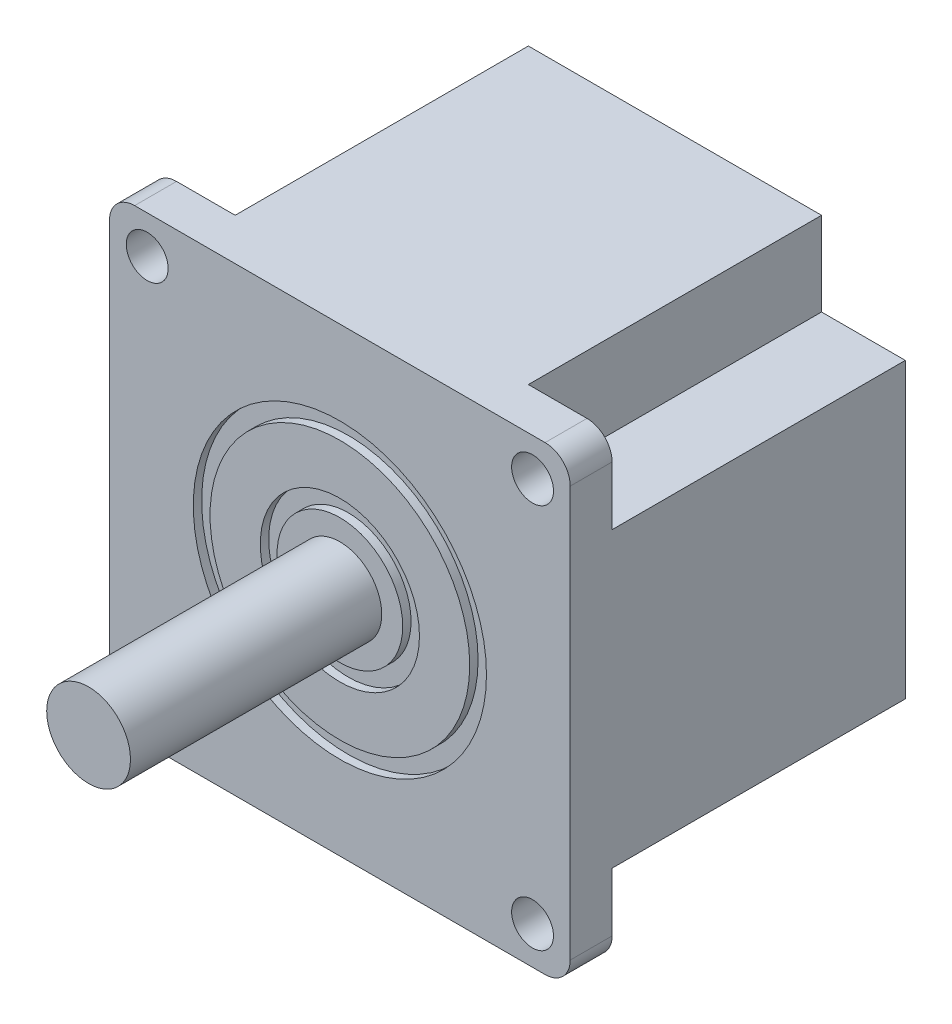
ISO-10303-21;
HEADER;
FILE_DESCRIPTION(('STEP AP214'),'2;1');
FILE_NAME('part.step','',(''),(''),'','','');
FILE_SCHEMA(('AUTOMOTIVE_DESIGN { 1 0 10303 214 1 1 1 1 }'));
ENDSEC;
DATA;
#1=APPLICATION_CONTEXT('core data for automotive mechanical design processes');
#2=APPLICATION_PROTOCOL_DEFINITION('international standard','automotive_design',2000,#1);
#3=PRODUCT_CONTEXT('',#1,'mechanical');
#4=PRODUCT('Part','Part','',(#3));
#5=PRODUCT_RELATED_PRODUCT_CATEGORY('part','',(#4));
#6=PRODUCT_DEFINITION_FORMATION('','',#4);
#7=PRODUCT_DEFINITION_CONTEXT('part definition',#1,'design');
#8=PRODUCT_DEFINITION('design','',#6,#7);
#9=PRODUCT_DEFINITION_SHAPE('','',#8);
#10=(LENGTH_UNIT() NAMED_UNIT(*) SI_UNIT(.MILLI.,.METRE.));
#11=(NAMED_UNIT(*) PLANE_ANGLE_UNIT() SI_UNIT($,.RADIAN.));
#12=(NAMED_UNIT(*) SI_UNIT($,.STERADIAN.) SOLID_ANGLE_UNIT());
#13=UNCERTAINTY_MEASURE_WITH_UNIT(LENGTH_MEASURE(1.E-05),#10,'distance_accuracy_value','');
#14=(GEOMETRIC_REPRESENTATION_CONTEXT(3) GLOBAL_UNCERTAINTY_ASSIGNED_CONTEXT((#13)) GLOBAL_UNIT_ASSIGNED_CONTEXT((#10,
#11,#12)) REPRESENTATION_CONTEXT('',''));
#15=CARTESIAN_POINT('',(0.,0.,0.));
#16=DIRECTION('',(0.,0.,1.));
#17=DIRECTION('',(1.,0.,0.));
#18=AXIS2_PLACEMENT_3D('',#15,#16,#17);
#19=CARTESIAN_POINT('',(-17.5,27.5,40.));
#20=DIRECTION('',(1.,0.,0.));
#21=DIRECTION('',(0.,0.,-1.));
#22=AXIS2_PLACEMENT_3D('',#19,#20,#21);
#23=PLANE('',#22);
#24=DIRECTION('',(0.,-1.,0.));
#25=VECTOR('',#24,1.);
#26=CARTESIAN_POINT('',(-17.5,27.5,35.));
#27=LINE('',#26,#25);
#28=CARTESIAN_POINT('',(-17.5,27.5,35.));
#29=VERTEX_POINT('',#28);
#30=CARTESIAN_POINT('',(-17.5,17.5,35.));
#31=VERTEX_POINT('',#30);
#32=EDGE_CURVE('E245',#29,#31,#27,.T.);
#33=ORIENTED_EDGE('',*,*,#32,.F.);
#34=DIRECTION('',(0.,0.,-1.));
#35=VECTOR('',#34,1.);
#36=CARTESIAN_POINT('',(-17.5,27.5,40.));
#37=LINE('',#36,#35);
#38=CARTESIAN_POINT('',(-17.5,27.5,0.));
#39=VERTEX_POINT('',#38);
#40=EDGE_CURVE('E62',#29,#39,#37,.T.);
#41=ORIENTED_EDGE('',*,*,#40,.T.);
#42=DIRECTION('',(0.,-1.,0.));
#43=VECTOR('',#42,1.);
#44=CARTESIAN_POINT('',(-17.5,27.5,0.));
#45=LINE('',#44,#43);
#46=CARTESIAN_POINT('',(-17.5,17.5,0.));
#47=VERTEX_POINT('',#46);
#48=EDGE_CURVE('E248',#39,#47,#45,.T.);
#49=ORIENTED_EDGE('',*,*,#48,.T.);
#50=DIRECTION('',(0.,0.,-1.));
#51=VECTOR('',#50,1.);
#52=CARTESIAN_POINT('',(-17.5,17.5,40.));
#53=LINE('',#52,#51);
#54=EDGE_CURVE('E55',#31,#47,#53,.T.);
#55=ORIENTED_EDGE('',*,*,#54,.F.);
#56=EDGE_LOOP('',(#33,#41,#49,#55));
#57=FACE_BOUND('',#56,.T.);
#58=ADVANCED_FACE('F47',(#57),#23,.F.);
#59=CARTESIAN_POINT('',(-17.5,17.5,40.));
#60=DIRECTION('',(0.,-1.,0.));
#61=DIRECTION('',(0.,0.,-1.));
#62=AXIS2_PLACEMENT_3D('',#59,#60,#61);
#63=PLANE('',#62);
#64=DIRECTION('',(-1.,0.,0.));
#65=VECTOR('',#64,1.);
#66=CARTESIAN_POINT('',(-17.5,17.5,35.));
#67=LINE('',#66,#65);
#68=CARTESIAN_POINT('',(-27.5,17.5,35.));
#69=VERTEX_POINT('',#68);
#70=EDGE_CURVE('E242',#31,#69,#67,.T.);
#71=ORIENTED_EDGE('',*,*,#70,.F.);
#72=ORIENTED_EDGE('',*,*,#54,.T.);
#73=DIRECTION('',(-1.,0.,0.));
#74=VECTOR('',#73,1.);
#75=CARTESIAN_POINT('',(-17.5,17.5,0.));
#76=LINE('',#75,#74);
#77=CARTESIAN_POINT('',(-27.5,17.5,0.));
#78=VERTEX_POINT('',#77);
#79=EDGE_CURVE('E264',#47,#78,#76,.T.);
#80=ORIENTED_EDGE('',*,*,#79,.T.);
#81=DIRECTION('',(0.,0.,-1.));
#82=VECTOR('',#81,1.);
#83=CARTESIAN_POINT('',(-27.5,17.5,40.));
#84=LINE('',#83,#82);
#85=EDGE_CURVE('E333',#69,#78,#84,.T.);
#86=ORIENTED_EDGE('',*,*,#85,.F.);
#87=EDGE_LOOP('',(#71,#72,#80,#86));
#88=FACE_BOUND('',#87,.T.);
#89=ADVANCED_FACE('F340',(#88),#63,.F.);
#90=CARTESIAN_POINT('',(-17.5,-17.5,40.));
#91=DIRECTION('',(0.,1.,0.));
#92=DIRECTION('',(0.,0.,1.));
#93=AXIS2_PLACEMENT_3D('',#90,#91,#92);
#94=PLANE('',#93);
#95=DIRECTION('',(1.,0.,0.));
#96=VECTOR('',#95,1.);
#97=CARTESIAN_POINT('',(-17.5,-17.5,35.));
#98=LINE('',#97,#96);
#99=CARTESIAN_POINT('',(-27.5,-17.5,35.));
#100=VERTEX_POINT('',#99);
#101=CARTESIAN_POINT('',(-17.5,-17.5,35.));
#102=VERTEX_POINT('',#101);
#103=EDGE_CURVE('E239',#100,#102,#98,.T.);
#104=ORIENTED_EDGE('',*,*,#103,.F.);
#105=DIRECTION('',(0.,0.,-1.));
#106=VECTOR('',#105,1.);
#107=CARTESIAN_POINT('',(-27.5,-17.5,40.));
#108=LINE('',#107,#106);
#109=CARTESIAN_POINT('',(-27.5,-17.5,0.));
#110=VERTEX_POINT('',#109);
#111=EDGE_CURVE('E330',#100,#110,#108,.T.);
#112=ORIENTED_EDGE('',*,*,#111,.T.);
#113=DIRECTION('',(1.,0.,0.));
#114=VECTOR('',#113,1.);
#115=CARTESIAN_POINT('',(-17.5,-17.5,0.));
#116=LINE('',#115,#114);
#117=CARTESIAN_POINT('',(-17.5,-17.5,0.));
#118=VERTEX_POINT('',#117);
#119=EDGE_CURVE('E272',#110,#118,#116,.T.);
#120=ORIENTED_EDGE('',*,*,#119,.T.);
#121=DIRECTION('',(0.,0.,-1.));
#122=VECTOR('',#121,1.);
#123=CARTESIAN_POINT('',(-17.5,-17.5,40.));
#124=LINE('',#123,#122);
#125=EDGE_CURVE('E327',#102,#118,#124,.T.);
#126=ORIENTED_EDGE('',*,*,#125,.F.);
#127=EDGE_LOOP('',(#104,#112,#120,#126));
#128=FACE_BOUND('',#127,.T.);
#129=ADVANCED_FACE('F353',(#128),#94,.F.);
#130=CARTESIAN_POINT('',(-17.5,-27.5,40.));
#131=DIRECTION('',(1.,0.,0.));
#132=DIRECTION('',(0.,1.,0.));
#133=AXIS2_PLACEMENT_3D('',#130,#131,#132);
#134=PLANE('',#133);
#135=DIRECTION('',(0.,-1.,0.));
#136=VECTOR('',#135,1.);
#137=CARTESIAN_POINT('',(-17.5,-27.5,35.));
#138=LINE('',#137,#136);
#139=CARTESIAN_POINT('',(-17.5,-27.5,35.));
#140=VERTEX_POINT('',#139);
#141=EDGE_CURVE('E236',#102,#140,#138,.T.);
#142=ORIENTED_EDGE('',*,*,#141,.F.);
#143=ORIENTED_EDGE('',*,*,#125,.T.);
#144=DIRECTION('',(0.,-1.,0.));
#145=VECTOR('',#144,1.);
#146=CARTESIAN_POINT('',(-17.5,-27.5,0.));
#147=LINE('',#146,#145);
#148=CARTESIAN_POINT('',(-17.5,-27.5,0.));
#149=VERTEX_POINT('',#148);
#150=EDGE_CURVE('E276',#118,#149,#147,.T.);
#151=ORIENTED_EDGE('',*,*,#150,.T.);
#152=DIRECTION('',(0.,0.,-1.));
#153=VECTOR('',#152,1.);
#154=CARTESIAN_POINT('',(-17.5,-27.5,40.));
#155=LINE('',#154,#153);
#156=EDGE_CURVE('E324',#140,#149,#155,.T.);
#157=ORIENTED_EDGE('',*,*,#156,.F.);
#158=EDGE_LOOP('',(#142,#143,#151,#157));
#159=FACE_BOUND('',#158,.T.);
#160=ADVANCED_FACE('F357',(#159),#134,.F.);
#161=CARTESIAN_POINT('',(17.5,-27.5,40.));
#162=DIRECTION('',(-1.,0.,0.));
#163=DIRECTION('',(0.,0.,1.));
#164=AXIS2_PLACEMENT_3D('',#161,#162,#163);
#165=PLANE('',#164);
#166=DIRECTION('',(0.,1.,0.));
#167=VECTOR('',#166,1.);
#168=CARTESIAN_POINT('',(17.5,-27.5,35.));
#169=LINE('',#168,#167);
#170=CARTESIAN_POINT('',(17.5,-27.5,35.));
#171=VERTEX_POINT('',#170);
#172=CARTESIAN_POINT('',(17.5,-17.5,35.));
#173=VERTEX_POINT('',#172);
#174=EDGE_CURVE('E233',#171,#173,#169,.T.);
#175=ORIENTED_EDGE('',*,*,#174,.F.);
#176=DIRECTION('',(0.,0.,-1.));
#177=VECTOR('',#176,1.);
#178=CARTESIAN_POINT('',(17.5,-27.5,40.));
#179=LINE('',#178,#177);
#180=CARTESIAN_POINT('',(17.5,-27.5,0.));
#181=VERTEX_POINT('',#180);
#182=EDGE_CURVE('E321',#171,#181,#179,.T.);
#183=ORIENTED_EDGE('',*,*,#182,.T.);
#184=DIRECTION('',(0.,1.,0.));
#185=VECTOR('',#184,1.);
#186=CARTESIAN_POINT('',(17.5,-27.5,0.));
#187=LINE('',#186,#185);
#188=CARTESIAN_POINT('',(17.5,-17.5,0.));
#189=VERTEX_POINT('',#188);
#190=EDGE_CURVE('E284',#181,#189,#187,.T.);
#191=ORIENTED_EDGE('',*,*,#190,.T.);
#192=DIRECTION('',(0.,0.,-1.));
#193=VECTOR('',#192,1.);
#194=CARTESIAN_POINT('',(17.5,-17.5,40.));
#195=LINE('',#194,#193);
#196=EDGE_CURVE('E318',#173,#189,#195,.T.);
#197=ORIENTED_EDGE('',*,*,#196,.F.);
#198=EDGE_LOOP('',(#175,#183,#191,#197));
#199=FACE_BOUND('',#198,.T.);
#200=ADVANCED_FACE('F369',(#199),#165,.F.);
#201=CARTESIAN_POINT('',(17.5,-17.5,40.));
#202=DIRECTION('',(0.,1.,0.));
#203=DIRECTION('',(-1.,0.,0.));
#204=AXIS2_PLACEMENT_3D('',#201,#202,#203);
#205=PLANE('',#204);
#206=DIRECTION('',(1.,0.,0.));
#207=VECTOR('',#206,1.);
#208=CARTESIAN_POINT('',(17.5,-17.5,35.));
#209=LINE('',#208,#207);
#210=CARTESIAN_POINT('',(27.5,-17.5,35.));
#211=VERTEX_POINT('',#210);
#212=EDGE_CURVE('E230',#173,#211,#209,.T.);
#213=ORIENTED_EDGE('',*,*,#212,.F.);
#214=ORIENTED_EDGE('',*,*,#196,.T.);
#215=DIRECTION('',(1.,0.,0.));
#216=VECTOR('',#215,1.);
#217=CARTESIAN_POINT('',(17.5,-17.5,0.));
#218=LINE('',#217,#216);
#219=CARTESIAN_POINT('',(27.5,-17.5,0.));
#220=VERTEX_POINT('',#219);
#221=EDGE_CURVE('E288',#189,#220,#218,.T.);
#222=ORIENTED_EDGE('',*,*,#221,.T.);
#223=DIRECTION('',(0.,0.,-1.));
#224=VECTOR('',#223,1.);
#225=CARTESIAN_POINT('',(27.5,-17.5,40.));
#226=LINE('',#225,#224);
#227=EDGE_CURVE('E315',#211,#220,#226,.T.);
#228=ORIENTED_EDGE('',*,*,#227,.F.);
#229=EDGE_LOOP('',(#213,#214,#222,#228));
#230=FACE_BOUND('',#229,.T.);
#231=ADVANCED_FACE('F377',(#230),#205,.F.);
#232=CARTESIAN_POINT('',(17.5,17.5,40.));
#233=DIRECTION('',(0.,-1.,0.));
#234=DIRECTION('',(1.,0.,0.));
#235=AXIS2_PLACEMENT_3D('',#232,#233,#234);
#236=PLANE('',#235);
#237=DIRECTION('',(-1.,0.,0.));
#238=VECTOR('',#237,1.);
#239=CARTESIAN_POINT('',(17.5,17.5,35.));
#240=LINE('',#239,#238);
#241=CARTESIAN_POINT('',(27.5,17.5,35.));
#242=VERTEX_POINT('',#241);
#243=CARTESIAN_POINT('',(17.5,17.5,35.));
#244=VERTEX_POINT('',#243);
#245=EDGE_CURVE('E226',#242,#244,#240,.T.);
#246=ORIENTED_EDGE('',*,*,#245,.F.);
#247=DIRECTION('',(0.,0.,-1.));
#248=VECTOR('',#247,1.);
#249=CARTESIAN_POINT('',(27.5,17.5,40.));
#250=LINE('',#249,#248);
#251=CARTESIAN_POINT('',(27.5,17.5,0.));
#252=VERTEX_POINT('',#251);
#253=EDGE_CURVE('E312',#242,#252,#250,.T.);
#254=ORIENTED_EDGE('',*,*,#253,.T.);
#255=DIRECTION('',(-1.,0.,0.));
#256=VECTOR('',#255,1.);
#257=CARTESIAN_POINT('',(17.5,17.5,0.));
#258=LINE('',#257,#256);
#259=CARTESIAN_POINT('',(17.5,17.5,0.));
#260=VERTEX_POINT('',#259);
#261=EDGE_CURVE('E296',#252,#260,#258,.T.);
#262=ORIENTED_EDGE('',*,*,#261,.T.);
#263=DIRECTION('',(0.,0.,-1.));
#264=VECTOR('',#263,1.);
#265=CARTESIAN_POINT('',(17.5,17.5,40.));
#266=LINE('',#265,#264);
#267=EDGE_CURVE('E309',#244,#260,#266,.T.);
#268=ORIENTED_EDGE('',*,*,#267,.F.);
#269=EDGE_LOOP('',(#246,#254,#262,#268));
#270=FACE_BOUND('',#269,.T.);
#271=ADVANCED_FACE('F381',(#270),#236,.F.);
#272=CARTESIAN_POINT('',(17.5,27.5,40.));
#273=DIRECTION('',(-1.,0.,0.));
#274=DIRECTION('',(0.,0.,1.));
#275=AXIS2_PLACEMENT_3D('',#272,#273,#274);
#276=PLANE('',#275);
#277=DIRECTION('',(0.,1.,0.));
#278=VECTOR('',#277,1.);
#279=CARTESIAN_POINT('',(17.5,27.5,35.));
#280=LINE('',#279,#278);
#281=CARTESIAN_POINT('',(17.5,27.5,35.));
#282=VERTEX_POINT('',#281);
#283=EDGE_CURVE('E223',#244,#282,#280,.T.);
#284=ORIENTED_EDGE('',*,*,#283,.F.);
#285=ORIENTED_EDGE('',*,*,#267,.T.);
#286=DIRECTION('',(0.,1.,0.));
#287=VECTOR('',#286,1.);
#288=CARTESIAN_POINT('',(17.5,27.5,0.));
#289=LINE('',#288,#287);
#290=CARTESIAN_POINT('',(17.5,27.5,0.));
#291=VERTEX_POINT('',#290);
#292=EDGE_CURVE('E300',#260,#291,#289,.T.);
#293=ORIENTED_EDGE('',*,*,#292,.T.);
#294=DIRECTION('',(0.,0.,-1.));
#295=VECTOR('',#294,1.);
#296=CARTESIAN_POINT('',(17.5,27.5,40.));
#297=LINE('',#296,#295);
#298=EDGE_CURVE('E69',#282,#291,#297,.T.);
#299=ORIENTED_EDGE('',*,*,#298,.F.);
#300=EDGE_LOOP('',(#284,#285,#293,#299));
#301=FACE_BOUND('',#300,.T.);
#302=ADVANCED_FACE('F364',(#301),#276,.F.);
#303=CARTESIAN_POINT('',(-27.5,-17.5,40.));
#304=DIRECTION('',(1.,0.,0.));
#305=DIRECTION('',(0.,0.,-1.));
#306=AXIS2_PLACEMENT_3D('',#303,#304,#305);
#307=PLANE('',#306);
#308=DIRECTION('',(0.,-1.,0.));
#309=VECTOR('',#308,1.);
#310=CARTESIAN_POINT('',(-27.5,-17.5,40.));
#311=LINE('',#310,#309);
#312=CARTESIAN_POINT('',(-27.5,24.5,40.));
#313=VERTEX_POINT('',#312);
#314=CARTESIAN_POINT('',(-27.5,-24.5,40.));
#315=VERTEX_POINT('',#314);
#316=EDGE_CURVE('E249',#313,#315,#311,.T.);
#317=ORIENTED_EDGE('',*,*,#316,.F.);
#318=DIRECTION('',(0.,0.,1.));
#319=VECTOR('',#318,1.);
#320=CARTESIAN_POINT('',(-27.5,24.5,35.));
#321=LINE('',#320,#319);
#322=CARTESIAN_POINT('',(-27.5,24.5,35.));
#323=VERTEX_POINT('',#322);
#324=EDGE_CURVE('E211',#323,#313,#321,.T.);
#325=ORIENTED_EDGE('',*,*,#324,.F.);
#326=DIRECTION('',(0.,-1.,0.));
#327=VECTOR('',#326,1.);
#328=CARTESIAN_POINT('',(-27.5,0.,35.));
#329=LINE('',#328,#327);
#330=EDGE_CURVE('E201',#323,#69,#329,.T.);
#331=ORIENTED_EDGE('',*,*,#330,.T.);
#332=ORIENTED_EDGE('',*,*,#85,.T.);
#333=DIRECTION('',(0.,-1.,0.));
#334=VECTOR('',#333,1.);
#335=CARTESIAN_POINT('',(-27.5,-17.5,0.));
#336=LINE('',#335,#334);
#337=EDGE_CURVE('E268',#78,#110,#336,.T.);
#338=ORIENTED_EDGE('',*,*,#337,.T.);
#339=ORIENTED_EDGE('',*,*,#111,.F.);
#340=CARTESIAN_POINT('',(-27.5,-24.5,35.));
#341=VERTEX_POINT('',#340);
#342=EDGE_CURVE('E205',#100,#341,#329,.T.);
#343=ORIENTED_EDGE('',*,*,#342,.T.);
#344=DIRECTION('',(0.,0.,1.));
#345=VECTOR('',#344,1.);
#346=CARTESIAN_POINT('',(-27.5,-24.5,35.));
#347=LINE('',#346,#345);
#348=EDGE_CURVE('E216',#341,#315,#347,.T.);
#349=ORIENTED_EDGE('',*,*,#348,.T.);
#350=EDGE_LOOP('',(#317,#325,#331,#332,#338,#339,#343,#349));
#351=FACE_BOUND('',#350,.T.);
#352=ADVANCED_FACE('F361',(#351),#307,.F.);
#353=CARTESIAN_POINT('',(-17.5,-27.5,40.));
#354=DIRECTION('',(0.,1.,0.));
#355=DIRECTION('',(0.,0.,1.));
#356=AXIS2_PLACEMENT_3D('',#353,#354,#355);
#357=PLANE('',#356);
#358=DIRECTION('',(1.,0.,0.));
#359=VECTOR('',#358,1.);
#360=CARTESIAN_POINT('',(-17.5,-27.5,40.));
#361=LINE('',#360,#359);
#362=CARTESIAN_POINT('',(-24.5,-27.5,40.));
#363=VERTEX_POINT('',#362);
#364=CARTESIAN_POINT('',(24.5,-27.5,40.));
#365=VERTEX_POINT('',#364);
#366=EDGE_CURVE('E252',#363,#365,#361,.T.);
#367=ORIENTED_EDGE('',*,*,#366,.F.);
#368=DIRECTION('',(0.,0.,1.));
#369=VECTOR('',#368,1.);
#370=CARTESIAN_POINT('',(-24.5,-27.5,35.));
#371=LINE('',#370,#369);
#372=CARTESIAN_POINT('',(-24.5,-27.5,35.));
#373=VERTEX_POINT('',#372);
#374=EDGE_CURVE('E593',#373,#363,#371,.T.);
#375=ORIENTED_EDGE('',*,*,#374,.F.);
#376=DIRECTION('',(1.,0.,0.));
#377=VECTOR('',#376,1.);
#378=CARTESIAN_POINT('',(0.,-27.5,35.));
#379=LINE('',#378,#377);
#380=EDGE_CURVE('E521',#373,#140,#379,.T.);
#381=ORIENTED_EDGE('',*,*,#380,.T.);
#382=ORIENTED_EDGE('',*,*,#156,.T.);
#383=DIRECTION('',(1.,0.,0.));
#384=VECTOR('',#383,1.);
#385=CARTESIAN_POINT('',(-17.5,-27.5,0.));
#386=LINE('',#385,#384);
#387=EDGE_CURVE('E280',#149,#181,#386,.T.);
#388=ORIENTED_EDGE('',*,*,#387,.T.);
#389=ORIENTED_EDGE('',*,*,#182,.F.);
#390=CARTESIAN_POINT('',(24.5,-27.5,35.));
#391=VERTEX_POINT('',#390);
#392=EDGE_CURVE('E520',#171,#391,#379,.T.);
#393=ORIENTED_EDGE('',*,*,#392,.T.);
#394=DIRECTION('',(0.,0.,1.));
#395=VECTOR('',#394,1.);
#396=CARTESIAN_POINT('',(24.5,-27.5,35.));
#397=LINE('',#396,#395);
#398=EDGE_CURVE('E589',#391,#365,#397,.T.);
#399=ORIENTED_EDGE('',*,*,#398,.T.);
#400=EDGE_LOOP('',(#367,#375,#381,#382,#388,#389,#393,#399));
#401=FACE_BOUND('',#400,.T.);
#402=ADVANCED_FACE('F363',(#401),#357,.F.);
#403=CARTESIAN_POINT('',(27.5,-17.5,40.));
#404=DIRECTION('',(-1.,0.,0.));
#405=DIRECTION('',(0.,0.,1.));
#406=AXIS2_PLACEMENT_3D('',#403,#404,#405);
#407=PLANE('',#406);
#408=DIRECTION('',(0.,1.,0.));
#409=VECTOR('',#408,1.);
#410=CARTESIAN_POINT('',(27.5,-17.5,40.));
#411=LINE('',#410,#409);
#412=CARTESIAN_POINT('',(27.5,-24.5,40.));
#413=VERTEX_POINT('',#412);
#414=CARTESIAN_POINT('',(27.5,24.5,40.));
#415=VERTEX_POINT('',#414);
#416=EDGE_CURVE('E256',#413,#415,#411,.T.);
#417=ORIENTED_EDGE('',*,*,#416,.F.);
#418=DIRECTION('',(0.,0.,1.));
#419=VECTOR('',#418,1.);
#420=CARTESIAN_POINT('',(27.5,-24.5,35.));
#421=LINE('',#420,#419);
#422=CARTESIAN_POINT('',(27.5,-24.5,35.));
#423=VERTEX_POINT('',#422);
#424=EDGE_CURVE('E585',#423,#413,#421,.T.);
#425=ORIENTED_EDGE('',*,*,#424,.F.);
#426=DIRECTION('',(0.,1.,0.));
#427=VECTOR('',#426,1.);
#428=CARTESIAN_POINT('',(27.5,0.,35.));
#429=LINE('',#428,#427);
#430=EDGE_CURVE('E530',#423,#211,#429,.T.);
#431=ORIENTED_EDGE('',*,*,#430,.T.);
#432=ORIENTED_EDGE('',*,*,#227,.T.);
#433=DIRECTION('',(0.,1.,0.));
#434=VECTOR('',#433,1.);
#435=CARTESIAN_POINT('',(27.5,-17.5,0.));
#436=LINE('',#435,#434);
#437=EDGE_CURVE('E292',#220,#252,#436,.T.);
#438=ORIENTED_EDGE('',*,*,#437,.T.);
#439=ORIENTED_EDGE('',*,*,#253,.F.);
#440=CARTESIAN_POINT('',(27.5,24.5,35.));
#441=VERTEX_POINT('',#440);
#442=EDGE_CURVE('E529',#242,#441,#429,.T.);
#443=ORIENTED_EDGE('',*,*,#442,.T.);
#444=DIRECTION('',(0.,0.,1.));
#445=VECTOR('',#444,1.);
#446=CARTESIAN_POINT('',(27.5,24.5,35.));
#447=LINE('',#446,#445);
#448=EDGE_CURVE('E581',#441,#415,#447,.T.);
#449=ORIENTED_EDGE('',*,*,#448,.T.);
#450=EDGE_LOOP('',(#417,#425,#431,#432,#438,#439,#443,#449));
#451=FACE_BOUND('',#450,.T.);
#452=ADVANCED_FACE('F373',(#451),#407,.F.);
#453=CARTESIAN_POINT('',(-17.5,27.5,40.));
#454=DIRECTION('',(0.,-1.,0.));
#455=DIRECTION('',(0.,0.,-1.));
#456=AXIS2_PLACEMENT_3D('',#453,#454,#455);
#457=PLANE('',#456);
#458=DIRECTION('',(-1.,0.,0.));
#459=VECTOR('',#458,1.);
#460=CARTESIAN_POINT('',(-17.5,27.5,40.));
#461=LINE('',#460,#459);
#462=CARTESIAN_POINT('',(24.5,27.5,40.));
#463=VERTEX_POINT('',#462);
#464=CARTESIAN_POINT('',(-24.5,27.5,40.));
#465=VERTEX_POINT('',#464);
#466=EDGE_CURVE('E259',#463,#465,#461,.T.);
#467=ORIENTED_EDGE('',*,*,#466,.F.);
#468=DIRECTION('',(0.,0.,1.));
#469=VECTOR('',#468,1.);
#470=CARTESIAN_POINT('',(24.5,27.5,35.));
#471=LINE('',#470,#469);
#472=CARTESIAN_POINT('',(24.5,27.5,35.));
#473=VERTEX_POINT('',#472);
#474=EDGE_CURVE('E227',#473,#463,#471,.T.);
#475=ORIENTED_EDGE('',*,*,#474,.F.);
#476=DIRECTION('',(-1.,0.,0.));
#477=VECTOR('',#476,1.);
#478=CARTESIAN_POINT('',(0.,27.5,35.));
#479=LINE('',#478,#477);
#480=EDGE_CURVE('E193',#473,#282,#479,.T.);
#481=ORIENTED_EDGE('',*,*,#480,.T.);
#482=ORIENTED_EDGE('',*,*,#298,.T.);
#483=DIRECTION('',(-1.,0.,0.));
#484=VECTOR('',#483,1.);
#485=CARTESIAN_POINT('',(-17.5,27.5,0.));
#486=LINE('',#485,#484);
#487=EDGE_CURVE('E253',#291,#39,#486,.T.);
#488=ORIENTED_EDGE('',*,*,#487,.T.);
#489=ORIENTED_EDGE('',*,*,#40,.F.);
#490=CARTESIAN_POINT('',(-24.5,27.5,35.));
#491=VERTEX_POINT('',#490);
#492=EDGE_CURVE('E185',#29,#491,#479,.T.);
#493=ORIENTED_EDGE('',*,*,#492,.T.);
#494=DIRECTION('',(0.,0.,1.));
#495=VECTOR('',#494,1.);
#496=CARTESIAN_POINT('',(-24.5,27.5,35.));
#497=LINE('',#496,#495);
#498=EDGE_CURVE('E189',#491,#465,#497,.T.);
#499=ORIENTED_EDGE('',*,*,#498,.T.);
#500=EDGE_LOOP('',(#467,#475,#481,#482,#488,#489,#493,#499));
#501=FACE_BOUND('',#500,.T.);
#502=ADVANCED_FACE('F187',(#501),#457,.F.);
#503=CARTESIAN_POINT('',(0.,0.,40.));
#504=DIRECTION('',(0.,0.,-1.));
#505=DIRECTION('',(-1.,0.,0.));
#506=AXIS2_PLACEMENT_3D('',#503,#504,#505);
#507=PLANE('',#506);
#508=CARTESIAN_POINT('',(0.,0.,40.));
#509=DIRECTION('',(0.,0.,1.));
#510=DIRECTION('',(1.,0.,0.));
#511=AXIS2_PLACEMENT_3D('',#508,#509,#510);
#512=CIRCLE('',#511,17.5);
#513=CARTESIAN_POINT('',(17.5,0.,40.));
#514=VERTEX_POINT('',#513);
#515=EDGE_CURVE('E488',#514,#514,#512,.T.);
#516=ORIENTED_EDGE('',*,*,#515,.F.);
#517=EDGE_LOOP('',(#516));
#518=FACE_BOUND('',#517,.T.);
#519=ORIENTED_EDGE('',*,*,#466,.T.);
#520=CARTESIAN_POINT('',(-24.5,24.5,40.));
#521=DIRECTION('',(0.,0.,1.));
#522=DIRECTION('',(1.,0.,0.));
#523=AXIS2_PLACEMENT_3D('',#520,#521,#522);
#524=CIRCLE('',#523,3.);
#525=EDGE_CURVE('E209',#313,#465,#524,.F.);
#526=ORIENTED_EDGE('',*,*,#525,.F.);
#527=ORIENTED_EDGE('',*,*,#316,.T.);
#528=CARTESIAN_POINT('',(-24.5,-24.5,40.));
#529=DIRECTION('',(0.,0.,1.));
#530=DIRECTION('',(1.,0.,0.));
#531=AXIS2_PLACEMENT_3D('',#528,#529,#530);
#532=CIRCLE('',#531,3.);
#533=EDGE_CURVE('E551',#315,#363,#532,.T.);
#534=ORIENTED_EDGE('',*,*,#533,.T.);
#535=ORIENTED_EDGE('',*,*,#366,.T.);
#536=CARTESIAN_POINT('',(24.5,-24.5,40.));
#537=DIRECTION('',(0.,0.,1.));
#538=DIRECTION('',(1.,0.,0.));
#539=AXIS2_PLACEMENT_3D('',#536,#537,#538);
#540=CIRCLE('',#539,3.);
#541=EDGE_CURVE('E555',#413,#365,#540,.F.);
#542=ORIENTED_EDGE('',*,*,#541,.F.);
#543=ORIENTED_EDGE('',*,*,#416,.T.);
#544=CARTESIAN_POINT('',(24.5,24.5,40.));
#545=DIRECTION('',(0.,0.,1.));
#546=DIRECTION('',(1.,0.,0.));
#547=AXIS2_PLACEMENT_3D('',#544,#545,#546);
#548=CIRCLE('',#547,3.);
#549=EDGE_CURVE('E559',#463,#415,#548,.F.);
#550=ORIENTED_EDGE('',*,*,#549,.F.);
#551=EDGE_LOOP('',(#519,#526,#527,#534,#535,#542,#543,#550));
#552=FACE_BOUND('',#551,.T.);
#553=CARTESIAN_POINT('',(23.,23.,40.));
#554=DIRECTION('',(0.,0.,1.));
#555=DIRECTION('',(1.,0.,0.));
#556=AXIS2_PLACEMENT_3D('',#553,#554,#555);
#557=CIRCLE('',#556,2.5);
#558=CARTESIAN_POINT('',(25.5,23.,40.));
#559=VERTEX_POINT('',#558);
#560=EDGE_CURVE('E563',#559,#559,#557,.F.);
#561=ORIENTED_EDGE('',*,*,#560,.T.);
#562=EDGE_LOOP('',(#561));
#563=FACE_BOUND('',#562,.T.);
#564=CARTESIAN_POINT('',(23.,-23.,40.));
#565=DIRECTION('',(0.,0.,1.));
#566=DIRECTION('',(1.,0.,0.));
#567=AXIS2_PLACEMENT_3D('',#564,#565,#566);
#568=CIRCLE('',#567,2.5);
#569=CARTESIAN_POINT('',(25.5,-23.,40.));
#570=VERTEX_POINT('',#569);
#571=EDGE_CURVE('E567',#570,#570,#568,.T.);
#572=ORIENTED_EDGE('',*,*,#571,.F.);
#573=EDGE_LOOP('',(#572));
#574=FACE_BOUND('',#573,.T.);
#575=CARTESIAN_POINT('',(-23.,-23.,40.));
#576=DIRECTION('',(0.,0.,1.));
#577=DIRECTION('',(1.,0.,0.));
#578=AXIS2_PLACEMENT_3D('',#575,#576,#577);
#579=CIRCLE('',#578,2.5);
#580=CARTESIAN_POINT('',(-20.5,-23.,40.));
#581=VERTEX_POINT('',#580);
#582=EDGE_CURVE('E571',#581,#581,#579,.F.);
#583=ORIENTED_EDGE('',*,*,#582,.T.);
#584=EDGE_LOOP('',(#583));
#585=FACE_BOUND('',#584,.T.);
#586=CARTESIAN_POINT('',(-23.,23.,40.));
#587=DIRECTION('',(0.,0.,1.));
#588=DIRECTION('',(1.,0.,0.));
#589=AXIS2_PLACEMENT_3D('',#586,#587,#588);
#590=CIRCLE('',#589,2.5);
#591=CARTESIAN_POINT('',(-20.5,23.,40.));
#592=VERTEX_POINT('',#591);
#593=EDGE_CURVE('E194',#592,#592,#590,.T.);
#594=ORIENTED_EDGE('',*,*,#593,.F.);
#595=EDGE_LOOP('',(#594));
#596=FACE_BOUND('',#595,.T.);
#597=ADVANCED_FACE('F394',(#518,#552,#563,#574,#585,#596),#507,.F.);
#598=CARTESIAN_POINT('',(0.,0.,0.));
#599=DIRECTION('',(0.,0.,-1.));
#600=DIRECTION('',(-1.,0.,0.));
#601=AXIS2_PLACEMENT_3D('',#598,#599,#600);
#602=PLANE('',#601);
#603=ORIENTED_EDGE('',*,*,#48,.F.);
#604=ORIENTED_EDGE('',*,*,#487,.F.);
#605=ORIENTED_EDGE('',*,*,#292,.F.);
#606=ORIENTED_EDGE('',*,*,#261,.F.);
#607=ORIENTED_EDGE('',*,*,#437,.F.);
#608=ORIENTED_EDGE('',*,*,#221,.F.);
#609=ORIENTED_EDGE('',*,*,#190,.F.);
#610=ORIENTED_EDGE('',*,*,#387,.F.);
#611=ORIENTED_EDGE('',*,*,#150,.F.);
#612=ORIENTED_EDGE('',*,*,#119,.F.);
#613=ORIENTED_EDGE('',*,*,#337,.F.);
#614=ORIENTED_EDGE('',*,*,#79,.F.);
#615=EDGE_LOOP('',(#603,#604,#605,#606,#607,#608,#609,#610,#611,#612,#613,#614));
#616=FACE_BOUND('',#615,.T.);
#617=ADVANCED_FACE('F345',(#616),#602,.T.);
#618=CARTESIAN_POINT('',(24.5,24.5,35.));
#619=DIRECTION('',(0.,0.,1.));
#620=DIRECTION('',(1.,0.,0.));
#621=AXIS2_PLACEMENT_3D('',#618,#619,#620);
#622=CYLINDRICAL_SURFACE('',#621,3.);
#623=ORIENTED_EDGE('',*,*,#549,.T.);
#624=ORIENTED_EDGE('',*,*,#448,.F.);
#625=CARTESIAN_POINT('',(24.5,24.5,35.));
#626=DIRECTION('',(0.,0.,1.));
#627=DIRECTION('',(1.,0.,0.));
#628=AXIS2_PLACEMENT_3D('',#625,#626,#627);
#629=CIRCLE('',#628,3.);
#630=EDGE_CURVE('E534',#473,#441,#629,.F.);
#631=ORIENTED_EDGE('',*,*,#630,.F.);
#632=ORIENTED_EDGE('',*,*,#474,.T.);
#633=EDGE_LOOP('',(#623,#624,#631,#632));
#634=FACE_BOUND('',#633,.T.);
#635=ADVANCED_FACE('F397',(#634),#622,.T.);
#636=CARTESIAN_POINT('',(23.,23.,35.));
#637=DIRECTION('',(0.,0.,1.));
#638=DIRECTION('',(1.,0.,0.));
#639=AXIS2_PLACEMENT_3D('',#636,#637,#638);
#640=CYLINDRICAL_SURFACE('',#639,2.5);
#641=CARTESIAN_POINT('',(23.,23.,35.));
#642=DIRECTION('',(0.,0.,1.));
#643=DIRECTION('',(1.,0.,0.));
#644=AXIS2_PLACEMENT_3D('',#641,#642,#643);
#645=CIRCLE('',#644,2.5);
#646=CARTESIAN_POINT('',(25.5,23.,35.));
#647=VERTEX_POINT('',#646);
#648=EDGE_CURVE('E538',#647,#647,#645,.F.);
#649=ORIENTED_EDGE('',*,*,#648,.T.);
#650=EDGE_LOOP('',(#649));
#651=FACE_BOUND('',#650,.T.);
#652=ORIENTED_EDGE('',*,*,#560,.F.);
#653=EDGE_LOOP('',(#652));
#654=FACE_BOUND('',#653,.T.);
#655=ADVANCED_FACE('F420',(#651,#654),#640,.F.);
#656=CARTESIAN_POINT('',(0.,0.,35.));
#657=DIRECTION('',(0.,0.,1.));
#658=DIRECTION('',(1.,0.,0.));
#659=AXIS2_PLACEMENT_3D('',#656,#657,#658);
#660=PLANE('',#659);
#661=ORIENTED_EDGE('',*,*,#648,.F.);
#662=EDGE_LOOP('',(#661));
#663=FACE_BOUND('',#662,.T.);
#664=ORIENTED_EDGE('',*,*,#442,.F.);
#665=ORIENTED_EDGE('',*,*,#245,.T.);
#666=ORIENTED_EDGE('',*,*,#283,.T.);
#667=ORIENTED_EDGE('',*,*,#480,.F.);
#668=ORIENTED_EDGE('',*,*,#630,.T.);
#669=EDGE_LOOP('',(#664,#665,#666,#667,#668));
#670=FACE_BOUND('',#669,.T.);
#671=ADVANCED_FACE('F416',(#663,#670),#660,.F.);
#672=CARTESIAN_POINT('',(24.5,-24.5,35.));
#673=DIRECTION('',(0.,0.,1.));
#674=DIRECTION('',(1.,0.,0.));
#675=AXIS2_PLACEMENT_3D('',#672,#673,#674);
#676=CYLINDRICAL_SURFACE('',#675,3.);
#677=ORIENTED_EDGE('',*,*,#541,.T.);
#678=ORIENTED_EDGE('',*,*,#398,.F.);
#679=CARTESIAN_POINT('',(24.5,-24.5,35.));
#680=DIRECTION('',(0.,0.,1.));
#681=DIRECTION('',(1.,0.,0.));
#682=AXIS2_PLACEMENT_3D('',#679,#680,#681);
#683=CIRCLE('',#682,3.);
#684=EDGE_CURVE('E525',#423,#391,#683,.F.);
#685=ORIENTED_EDGE('',*,*,#684,.F.);
#686=ORIENTED_EDGE('',*,*,#424,.T.);
#687=EDGE_LOOP('',(#677,#678,#685,#686));
#688=FACE_BOUND('',#687,.T.);
#689=ADVANCED_FACE('F412',(#688),#676,.T.);
#690=CARTESIAN_POINT('',(23.,-23.,35.));
#691=DIRECTION('',(0.,0.,1.));
#692=DIRECTION('',(1.,0.,0.));
#693=AXIS2_PLACEMENT_3D('',#690,#691,#692);
#694=CYLINDRICAL_SURFACE('',#693,2.5);
#695=CARTESIAN_POINT('',(23.,-23.,35.));
#696=DIRECTION('',(0.,0.,1.));
#697=DIRECTION('',(1.,0.,0.));
#698=AXIS2_PLACEMENT_3D('',#695,#696,#697);
#699=CIRCLE('',#698,2.5);
#700=CARTESIAN_POINT('',(25.5,-23.,35.));
#701=VERTEX_POINT('',#700);
#702=EDGE_CURVE('E542',#701,#701,#699,.T.);
#703=ORIENTED_EDGE('',*,*,#702,.F.);
#704=EDGE_LOOP('',(#703));
#705=FACE_BOUND('',#704,.T.);
#706=ORIENTED_EDGE('',*,*,#571,.T.);
#707=EDGE_LOOP('',(#706));
#708=FACE_BOUND('',#707,.T.);
#709=ADVANCED_FACE('F415',(#705,#708),#694,.F.);
#710=ORIENTED_EDGE('',*,*,#702,.T.);
#711=EDGE_LOOP('',(#710));
#712=FACE_BOUND('',#711,.T.);
#713=ORIENTED_EDGE('',*,*,#392,.F.);
#714=ORIENTED_EDGE('',*,*,#174,.T.);
#715=ORIENTED_EDGE('',*,*,#212,.T.);
#716=ORIENTED_EDGE('',*,*,#430,.F.);
#717=ORIENTED_EDGE('',*,*,#684,.T.);
#718=EDGE_LOOP('',(#713,#714,#715,#716,#717));
#719=FACE_BOUND('',#718,.T.);
#720=ADVANCED_FACE('F410',(#712,#719),#660,.F.);
#721=CARTESIAN_POINT('',(-24.5,-24.5,35.));
#722=DIRECTION('',(0.,0.,1.));
#723=DIRECTION('',(1.,0.,0.));
#724=AXIS2_PLACEMENT_3D('',#721,#722,#723);
#725=CYLINDRICAL_SURFACE('',#724,3.);
#726=ORIENTED_EDGE('',*,*,#533,.F.);
#727=ORIENTED_EDGE('',*,*,#348,.F.);
#728=CARTESIAN_POINT('',(-24.5,-24.5,35.));
#729=DIRECTION('',(0.,0.,1.));
#730=DIRECTION('',(1.,0.,0.));
#731=AXIS2_PLACEMENT_3D('',#728,#729,#730);
#732=CIRCLE('',#731,3.);
#733=EDGE_CURVE('E516',#341,#373,#732,.T.);
#734=ORIENTED_EDGE('',*,*,#733,.T.);
#735=ORIENTED_EDGE('',*,*,#374,.T.);
#736=EDGE_LOOP('',(#726,#727,#734,#735));
#737=FACE_BOUND('',#736,.T.);
#738=ADVANCED_FACE('F406',(#737),#725,.T.);
#739=CARTESIAN_POINT('',(-23.,-23.,35.));
#740=DIRECTION('',(0.,0.,1.));
#741=DIRECTION('',(1.,0.,0.));
#742=AXIS2_PLACEMENT_3D('',#739,#740,#741);
#743=CYLINDRICAL_SURFACE('',#742,2.5);
#744=CARTESIAN_POINT('',(-23.,-23.,35.));
#745=DIRECTION('',(0.,0.,1.));
#746=DIRECTION('',(1.,0.,0.));
#747=AXIS2_PLACEMENT_3D('',#744,#745,#746);
#748=CIRCLE('',#747,2.5);
#749=CARTESIAN_POINT('',(-20.5,-23.,35.));
#750=VERTEX_POINT('',#749);
#751=EDGE_CURVE('E219',#750,#750,#748,.F.);
#752=ORIENTED_EDGE('',*,*,#751,.T.);
#753=EDGE_LOOP('',(#752));
#754=FACE_BOUND('',#753,.T.);
#755=ORIENTED_EDGE('',*,*,#582,.F.);
#756=EDGE_LOOP('',(#755));
#757=FACE_BOUND('',#756,.T.);
#758=ADVANCED_FACE('F409',(#754,#757),#743,.F.);
#759=ORIENTED_EDGE('',*,*,#751,.F.);
#760=EDGE_LOOP('',(#759));
#761=FACE_BOUND('',#760,.T.);
#762=ORIENTED_EDGE('',*,*,#342,.F.);
#763=ORIENTED_EDGE('',*,*,#103,.T.);
#764=ORIENTED_EDGE('',*,*,#141,.T.);
#765=ORIENTED_EDGE('',*,*,#380,.F.);
#766=ORIENTED_EDGE('',*,*,#733,.F.);
#767=EDGE_LOOP('',(#762,#763,#764,#765,#766));
#768=FACE_BOUND('',#767,.T.);
#769=ADVANCED_FACE('F430',(#761,#768),#660,.F.);
#770=CARTESIAN_POINT('',(-23.,23.,35.));
#771=DIRECTION('',(0.,0.,1.));
#772=DIRECTION('',(1.,0.,0.));
#773=AXIS2_PLACEMENT_3D('',#770,#771,#772);
#774=CIRCLE('',#773,2.5);
#775=CARTESIAN_POINT('',(-20.5,23.,35.));
#776=VERTEX_POINT('',#775);
#777=EDGE_CURVE('E212',#776,#776,#774,.T.);
#778=ORIENTED_EDGE('',*,*,#777,.T.);
#779=EDGE_LOOP('',(#778));
#780=FACE_BOUND('',#779,.T.);
#781=ORIENTED_EDGE('',*,*,#492,.F.);
#782=ORIENTED_EDGE('',*,*,#32,.T.);
#783=ORIENTED_EDGE('',*,*,#70,.T.);
#784=ORIENTED_EDGE('',*,*,#330,.F.);
#785=CARTESIAN_POINT('',(-24.5,24.5,35.));
#786=DIRECTION('',(0.,0.,1.));
#787=DIRECTION('',(1.,0.,0.));
#788=AXIS2_PLACEMENT_3D('',#785,#786,#787);
#789=CIRCLE('',#788,3.);
#790=EDGE_CURVE('E198',#323,#491,#789,.F.);
#791=ORIENTED_EDGE('',*,*,#790,.T.);
#792=EDGE_LOOP('',(#781,#782,#783,#784,#791));
#793=FACE_BOUND('',#792,.T.);
#794=ADVANCED_FACE('F199',(#780,#793),#660,.F.);
#795=CARTESIAN_POINT('',(-24.5,24.5,35.));
#796=DIRECTION('',(0.,0.,1.));
#797=DIRECTION('',(1.,0.,0.));
#798=AXIS2_PLACEMENT_3D('',#795,#796,#797);
#799=CYLINDRICAL_SURFACE('',#798,3.);
#800=ORIENTED_EDGE('',*,*,#525,.T.);
#801=ORIENTED_EDGE('',*,*,#498,.F.);
#802=ORIENTED_EDGE('',*,*,#790,.F.);
#803=ORIENTED_EDGE('',*,*,#324,.T.);
#804=EDGE_LOOP('',(#800,#801,#802,#803));
#805=FACE_BOUND('',#804,.T.);
#806=ADVANCED_FACE('F207',(#805),#799,.T.);
#807=CARTESIAN_POINT('',(-23.,23.,35.));
#808=DIRECTION('',(0.,0.,1.));
#809=DIRECTION('',(1.,0.,0.));
#810=AXIS2_PLACEMENT_3D('',#807,#808,#809);
#811=CYLINDRICAL_SURFACE('',#810,2.5);
#812=ORIENTED_EDGE('',*,*,#777,.F.);
#813=EDGE_LOOP('',(#812));
#814=FACE_BOUND('',#813,.T.);
#815=ORIENTED_EDGE('',*,*,#593,.T.);
#816=EDGE_LOOP('',(#815));
#817=FACE_BOUND('',#816,.T.);
#818=ADVANCED_FACE('F405',(#814,#817),#811,.F.);
#819=CARTESIAN_POINT('',(0.,0.,39.));
#820=DIRECTION('',(0.,0.,1.));
#821=DIRECTION('',(1.,0.,0.));
#822=AXIS2_PLACEMENT_3D('',#819,#820,#821);
#823=CYLINDRICAL_SURFACE('',#822,15.5);
#824=CARTESIAN_POINT('',(0.,0.,39.));
#825=DIRECTION('',(0.,0.,1.));
#826=DIRECTION('',(1.,0.,0.));
#827=AXIS2_PLACEMENT_3D('',#824,#825,#826);
#828=CIRCLE('',#827,15.5);
#829=CARTESIAN_POINT('',(15.5,0.,39.));
#830=VERTEX_POINT('',#829);
#831=EDGE_CURVE('E476',#830,#830,#828,.T.);
#832=ORIENTED_EDGE('',*,*,#831,.T.);
#833=EDGE_LOOP('',(#832));
#834=FACE_BOUND('',#833,.T.);
#835=CARTESIAN_POINT('',(0.,0.,40.));
#836=DIRECTION('',(0.,0.,1.));
#837=DIRECTION('',(1.,0.,0.));
#838=AXIS2_PLACEMENT_3D('',#835,#836,#837);
#839=CIRCLE('',#838,15.5);
#840=CARTESIAN_POINT('',(15.5,0.,40.));
#841=VERTEX_POINT('',#840);
#842=EDGE_CURVE('E491',#841,#841,#839,.T.);
#843=ORIENTED_EDGE('',*,*,#842,.F.);
#844=EDGE_LOOP('',(#843));
#845=FACE_BOUND('',#844,.T.);
#846=ADVANCED_FACE('F434',(#834,#845),#823,.T.);
#847=CARTESIAN_POINT('',(0.,0.,39.));
#848=DIRECTION('',(0.,0.,1.));
#849=DIRECTION('',(1.,0.,0.));
#850=AXIS2_PLACEMENT_3D('',#847,#848,#849);
#851=CYLINDRICAL_SURFACE('',#850,17.5);
#852=CARTESIAN_POINT('',(0.,0.,39.));
#853=DIRECTION('',(0.,0.,1.));
#854=DIRECTION('',(1.,0.,0.));
#855=AXIS2_PLACEMENT_3D('',#852,#853,#854);
#856=CIRCLE('',#855,17.5);
#857=CARTESIAN_POINT('',(17.5,0.,39.));
#858=VERTEX_POINT('',#857);
#859=EDGE_CURVE('E479',#858,#858,#856,.T.);
#860=ORIENTED_EDGE('',*,*,#859,.F.);
#861=EDGE_LOOP('',(#860));
#862=FACE_BOUND('',#861,.T.);
#863=ORIENTED_EDGE('',*,*,#515,.T.);
#864=EDGE_LOOP('',(#863));
#865=FACE_BOUND('',#864,.T.);
#866=ADVANCED_FACE('F461',(#862,#865),#851,.F.);
#867=CARTESIAN_POINT('',(0.,0.,39.));
#868=DIRECTION('',(0.,0.,1.));
#869=DIRECTION('',(1.,0.,0.));
#870=AXIS2_PLACEMENT_3D('',#867,#868,#869);
#871=PLANE('',#870);
#872=ORIENTED_EDGE('',*,*,#831,.F.);
#873=EDGE_LOOP('',(#872));
#874=FACE_BOUND('',#873,.T.);
#875=ORIENTED_EDGE('',*,*,#859,.T.);
#876=EDGE_LOOP('',(#875));
#877=FACE_BOUND('',#876,.T.);
#878=ADVANCED_FACE('F465',(#874,#877),#871,.T.);
#879=CARTESIAN_POINT('',(0.,0.,40.));
#880=DIRECTION('',(0.,0.,1.));
#881=DIRECTION('',(1.,0.,0.));
#882=AXIS2_PLACEMENT_3D('',#879,#880,#881);
#883=CIRCLE('',#882,9.5);
#884=CARTESIAN_POINT('',(9.5,0.,40.));
#885=VERTEX_POINT('',#884);
#886=EDGE_CURVE('E486',#885,#885,#883,.T.);
#887=ORIENTED_EDGE('',*,*,#886,.F.);
#888=EDGE_LOOP('',(#887));
#889=FACE_BOUND('',#888,.T.);
#890=ORIENTED_EDGE('',*,*,#842,.T.);
#891=EDGE_LOOP('',(#890));
#892=FACE_BOUND('',#891,.T.);
#893=ADVANCED_FACE('F401',(#889,#892),#507,.F.);
#894=CARTESIAN_POINT('',(0.,0.,39.));
#895=DIRECTION('',(0.,0.,1.));
#896=DIRECTION('',(1.,0.,0.));
#897=AXIS2_PLACEMENT_3D('',#894,#895,#896);
#898=CYLINDRICAL_SURFACE('',#897,7.5);
#899=CARTESIAN_POINT('',(0.,0.,39.));
#900=DIRECTION('',(0.,0.,1.));
#901=DIRECTION('',(1.,0.,0.));
#902=AXIS2_PLACEMENT_3D('',#899,#900,#901);
#903=CIRCLE('',#902,7.5);
#904=CARTESIAN_POINT('',(7.5,0.,39.));
#905=VERTEX_POINT('',#904);
#906=EDGE_CURVE('E498',#905,#905,#903,.T.);
#907=ORIENTED_EDGE('',*,*,#906,.T.);
#908=EDGE_LOOP('',(#907));
#909=FACE_BOUND('',#908,.T.);
#910=CARTESIAN_POINT('',(0.,0.,40.));
#911=DIRECTION('',(0.,0.,1.));
#912=DIRECTION('',(1.,0.,0.));
#913=AXIS2_PLACEMENT_3D('',#910,#911,#912);
#914=CIRCLE('',#913,7.5);
#915=CARTESIAN_POINT('',(7.5,0.,40.));
#916=VERTEX_POINT('',#915);
#917=EDGE_CURVE('E481',#916,#916,#914,.T.);
#918=ORIENTED_EDGE('',*,*,#917,.F.);
#919=EDGE_LOOP('',(#918));
#920=FACE_BOUND('',#919,.T.);
#921=ADVANCED_FACE('F448',(#909,#920),#898,.T.);
#922=CARTESIAN_POINT('',(0.,0.,39.));
#923=DIRECTION('',(0.,0.,1.));
#924=DIRECTION('',(1.,0.,0.));
#925=AXIS2_PLACEMENT_3D('',#922,#923,#924);
#926=CYLINDRICAL_SURFACE('',#925,9.5);
#927=CARTESIAN_POINT('',(0.,0.,39.));
#928=DIRECTION('',(0.,0.,1.));
#929=DIRECTION('',(1.,0.,0.));
#930=AXIS2_PLACEMENT_3D('',#927,#928,#929);
#931=CIRCLE('',#930,9.5);
#932=CARTESIAN_POINT('',(9.5,0.,39.));
#933=VERTEX_POINT('',#932);
#934=EDGE_CURVE('E502',#933,#933,#931,.T.);
#935=ORIENTED_EDGE('',*,*,#934,.F.);
#936=EDGE_LOOP('',(#935));
#937=FACE_BOUND('',#936,.T.);
#938=ORIENTED_EDGE('',*,*,#886,.T.);
#939=EDGE_LOOP('',(#938));
#940=FACE_BOUND('',#939,.T.);
#941=ADVANCED_FACE('F451',(#937,#940),#926,.F.);
#942=CARTESIAN_POINT('',(0.,0.,39.));
#943=DIRECTION('',(0.,0.,1.));
#944=DIRECTION('',(1.,0.,0.));
#945=AXIS2_PLACEMENT_3D('',#942,#943,#944);
#946=PLANE('',#945);
#947=ORIENTED_EDGE('',*,*,#906,.F.);
#948=EDGE_LOOP('',(#947));
#949=FACE_BOUND('',#948,.T.);
#950=ORIENTED_EDGE('',*,*,#934,.T.);
#951=EDGE_LOOP('',(#950));
#952=FACE_BOUND('',#951,.T.);
#953=ADVANCED_FACE('F446',(#949,#952),#946,.T.);
#954=CARTESIAN_POINT('',(0.,0.,70.));
#955=DIRECTION('',(0.,0.,1.));
#956=DIRECTION('',(1.,0.,0.));
#957=AXIS2_PLACEMENT_3D('',#954,#955,#956);
#958=PLANE('',#957);
#959=CARTESIAN_POINT('',(0.,0.,70.));
#960=DIRECTION('',(0.,0.,1.));
#961=DIRECTION('',(1.,0.,0.));
#962=AXIS2_PLACEMENT_3D('',#959,#960,#961);
#963=CIRCLE('',#962,5.);
#964=CARTESIAN_POINT('',(5.,0.,70.));
#965=VERTEX_POINT('',#964);
#966=EDGE_CURVE('E505',#965,#965,#963,.T.);
#967=ORIENTED_EDGE('',*,*,#966,.T.);
#968=EDGE_LOOP('',(#967));
#969=FACE_BOUND('',#968,.T.);
#970=ADVANCED_FACE('F442',(#969),#958,.T.);
#971=CARTESIAN_POINT('',(0.,0.,70.));
#972=DIRECTION('',(0.,0.,-1.));
#973=DIRECTION('',(-1.,0.,0.));
#974=AXIS2_PLACEMENT_3D('',#971,#972,#973);
#975=CYLINDRICAL_SURFACE('',#974,5.);
#976=ORIENTED_EDGE('',*,*,#966,.F.);
#977=EDGE_LOOP('',(#976));
#978=FACE_BOUND('',#977,.T.);
#979=CARTESIAN_POINT('',(0.,0.,40.));
#980=DIRECTION('',(0.,0.,-1.));
#981=DIRECTION('',(-1.,0.,0.));
#982=AXIS2_PLACEMENT_3D('',#979,#980,#981);
#983=CIRCLE('',#982,5.);
#984=CARTESIAN_POINT('',(-5.,0.,40.));
#985=VERTEX_POINT('',#984);
#986=EDGE_CURVE('E12',#985,#985,#983,.F.);
#987=ORIENTED_EDGE('',*,*,#986,.T.);
#988=EDGE_LOOP('',(#987));
#989=FACE_BOUND('',#988,.T.);
#990=ADVANCED_FACE('F439',(#978,#989),#975,.T.);
#991=ORIENTED_EDGE('',*,*,#986,.F.);
#992=EDGE_LOOP('',(#991));
#993=FACE_BOUND('',#992,.T.);
#994=ORIENTED_EDGE('',*,*,#917,.T.);
#995=EDGE_LOOP('',(#994));
#996=FACE_BOUND('',#995,.T.);
#997=ADVANCED_FACE('F402',(#993,#996),#507,.F.);
#998=CLOSED_SHELL('',(#58,#89,#129,#160,#200,#231,#271,#302,#352,#402,#452,#502,#597,#617,#635,
#655,#671,#689,#709,#720,#738,#758,#769,#794,#806,#818,#846,#866,#878,#893,#921,#941,#953,#970,
#990,#997));
#999=MANIFOLD_SOLID_BREP('B2',#998);
#1000=ADVANCED_BREP_SHAPE_REPRESENTATION('',(#18,#999),#14);
#1001=SHAPE_DEFINITION_REPRESENTATION(#9,#1000);
ENDSEC;
END-ISO-10303-21;
